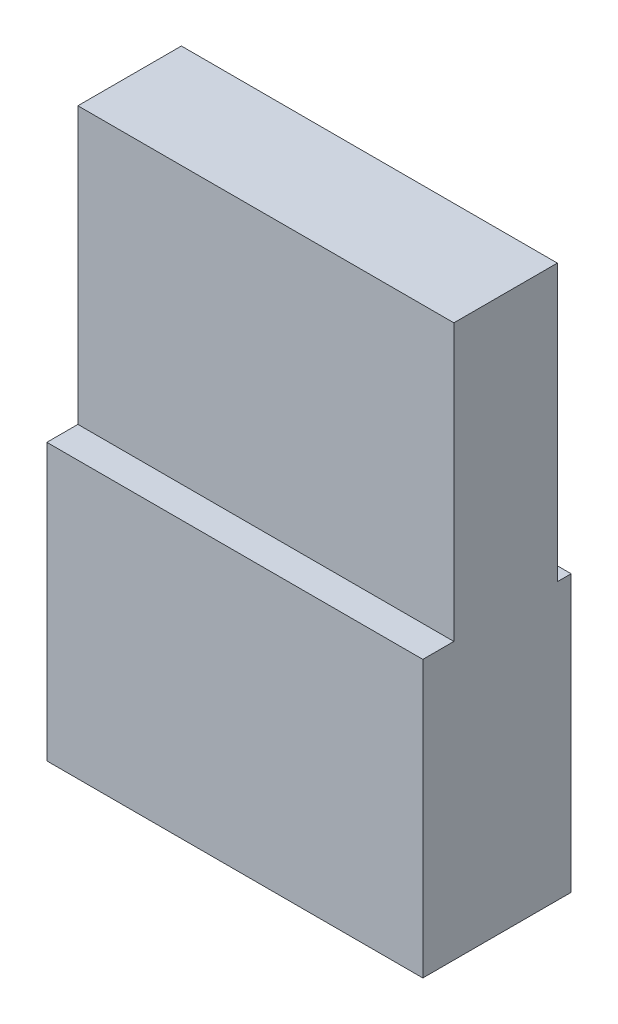
ISO-10303-21;
HEADER;
FILE_DESCRIPTION(('STEP AP214'),'2;1');
FILE_NAME('part.step','',(''),(''),'','','');
FILE_SCHEMA(('AUTOMOTIVE_DESIGN { 1 0 10303 214 1 1 1 1 }'));
ENDSEC;
DATA;
#1=APPLICATION_CONTEXT('core data for automotive mechanical design processes');
#2=APPLICATION_PROTOCOL_DEFINITION('international standard','automotive_design',2000,#1);
#3=PRODUCT_CONTEXT('',#1,'mechanical');
#4=PRODUCT('Part','Part','',(#3));
#5=PRODUCT_RELATED_PRODUCT_CATEGORY('part','',(#4));
#6=PRODUCT_DEFINITION_FORMATION('','',#4);
#7=PRODUCT_DEFINITION_CONTEXT('part definition',#1,'design');
#8=PRODUCT_DEFINITION('design','',#6,#7);
#9=PRODUCT_DEFINITION_SHAPE('','',#8);
#10=(LENGTH_UNIT() NAMED_UNIT(*) SI_UNIT(.MILLI.,.METRE.));
#11=(NAMED_UNIT(*) PLANE_ANGLE_UNIT() SI_UNIT($,.RADIAN.));
#12=(NAMED_UNIT(*) SI_UNIT($,.STERADIAN.) SOLID_ANGLE_UNIT());
#13=UNCERTAINTY_MEASURE_WITH_UNIT(LENGTH_MEASURE(1.E-05),#10,'distance_accuracy_value','');
#14=(GEOMETRIC_REPRESENTATION_CONTEXT(3) GLOBAL_UNCERTAINTY_ASSIGNED_CONTEXT((#13)) GLOBAL_UNIT_ASSIGNED_CONTEXT((#10,
#11,#12)) REPRESENTATION_CONTEXT('',''));
#15=CARTESIAN_POINT('',(0.,0.,0.));
#16=DIRECTION('',(0.,0.,1.));
#17=DIRECTION('',(1.,0.,0.));
#18=AXIS2_PLACEMENT_3D('',#15,#16,#17);
#19=CARTESIAN_POINT('',(0.,4.,0.));
#20=DIRECTION('',(0.,1.,0.));
#21=DIRECTION('',(0.,0.,1.));
#22=AXIS2_PLACEMENT_3D('',#19,#20,#21);
#23=PLANE('',#22);
#24=DIRECTION('',(-1.,0.,0.));
#25=VECTOR('',#24,1.);
#26=CARTESIAN_POINT('',(2.72500000000001,4.,-0.874999999999998));
#27=LINE('',#26,#25);
#28=CARTESIAN_POINT('',(2.72499999999999,4.,-0.874999999999998));
#29=VERTEX_POINT('',#28);
#30=CARTESIAN_POINT('',(-2.72500000000001,4.,-0.874999999999998));
#31=VERTEX_POINT('',#30);
#32=EDGE_CURVE('E118',#29,#31,#27,.T.);
#33=ORIENTED_EDGE('',*,*,#32,.F.);
#34=DIRECTION('',(0.,0.,-1.));
#35=VECTOR('',#34,1.);
#36=CARTESIAN_POINT('',(2.72499999999999,4.,-1.075));
#37=LINE('',#36,#35);
#38=CARTESIAN_POINT('',(2.72499999999999,4.,-1.075));
#39=VERTEX_POINT('',#38);
#40=EDGE_CURVE('E150',#29,#39,#37,.T.);
#41=ORIENTED_EDGE('',*,*,#40,.T.);
#42=DIRECTION('',(-1.,0.,0.));
#43=VECTOR('',#42,1.);
#44=CARTESIAN_POINT('',(-2.72500000000001,4.,-1.075));
#45=LINE('',#44,#43);
#46=CARTESIAN_POINT('',(-2.72500000000001,4.,-1.075));
#47=VERTEX_POINT('',#46);
#48=EDGE_CURVE('E146',#39,#47,#45,.T.);
#49=ORIENTED_EDGE('',*,*,#48,.T.);
#50=DIRECTION('',(0.,0.,1.));
#51=VECTOR('',#50,1.);
#52=CARTESIAN_POINT('',(-2.72500000000001,4.,-1.075));
#53=LINE('',#52,#51);
#54=EDGE_CURVE('E57',#47,#31,#53,.T.);
#55=ORIENTED_EDGE('',*,*,#54,.T.);
#56=EDGE_LOOP('',(#33,#41,#49,#55));
#57=FACE_BOUND('',#56,.T.);
#58=ADVANCED_FACE('F32',(#57),#23,.T.);
#59=CARTESIAN_POINT('',(2.72499999999999,4.,-1.075));
#60=DIRECTION('',(-1.,0.,0.));
#61=DIRECTION('',(0.,0.,1.));
#62=AXIS2_PLACEMENT_3D('',#59,#60,#61);
#63=PLANE('',#62);
#64=DIRECTION('',(0.,0.,-1.));
#65=VECTOR('',#64,1.);
#66=CARTESIAN_POINT('',(2.72499999999999,0.,-1.075));
#67=LINE('',#66,#65);
#68=CARTESIAN_POINT('',(2.72499999999999,0.,1.075));
#69=VERTEX_POINT('',#68);
#70=CARTESIAN_POINT('',(2.72499999999999,0.,-1.075));
#71=VERTEX_POINT('',#70);
#72=EDGE_CURVE('E123',#69,#71,#67,.T.);
#73=ORIENTED_EDGE('',*,*,#72,.T.);
#74=DIRECTION('',(0.,-1.,0.));
#75=VECTOR('',#74,1.);
#76=CARTESIAN_POINT('',(2.72499999999999,4.,-1.075));
#77=LINE('',#76,#75);
#78=EDGE_CURVE('E11',#39,#71,#77,.T.);
#79=ORIENTED_EDGE('',*,*,#78,.F.);
#80=ORIENTED_EDGE('',*,*,#40,.F.);
#81=DIRECTION('',(0.,-1.,0.));
#82=VECTOR('',#81,1.);
#83=CARTESIAN_POINT('',(2.72500000000001,8.,-0.874999999999998));
#84=LINE('',#83,#82);
#85=CARTESIAN_POINT('',(2.72500000000001,8.,-0.874999999999998));
#86=VERTEX_POINT('',#85);
#87=EDGE_CURVE('E128',#86,#29,#84,.T.);
#88=ORIENTED_EDGE('',*,*,#87,.F.);
#89=DIRECTION('',(0.,0.,-1.));
#90=VECTOR('',#89,1.);
#91=CARTESIAN_POINT('',(2.72500000000001,8.,-0.874999999999998));
#92=LINE('',#91,#90);
#93=CARTESIAN_POINT('',(2.72500000000001,8.,0.625000000000002));
#94=VERTEX_POINT('',#93);
#95=EDGE_CURVE('E108',#94,#86,#92,.T.);
#96=ORIENTED_EDGE('',*,*,#95,.F.);
#97=DIRECTION('',(0.,-1.,0.));
#98=VECTOR('',#97,1.);
#99=CARTESIAN_POINT('',(2.72500000000001,8.,0.625000000000002));
#100=LINE('',#99,#98);
#101=CARTESIAN_POINT('',(2.72500000000001,4.,0.625000000000002));
#102=VERTEX_POINT('',#101);
#103=EDGE_CURVE('E105',#94,#102,#100,.T.);
#104=ORIENTED_EDGE('',*,*,#103,.T.);
#105=CARTESIAN_POINT('',(2.72499999999999,4.,1.075));
#106=VERTEX_POINT('',#105);
#107=EDGE_CURVE('E153',#106,#102,#37,.T.);
#108=ORIENTED_EDGE('',*,*,#107,.F.);
#109=DIRECTION('',(0.,-1.,0.));
#110=VECTOR('',#109,1.);
#111=CARTESIAN_POINT('',(2.72499999999999,4.,1.075));
#112=LINE('',#111,#110);
#113=EDGE_CURVE('E160',#106,#69,#112,.T.);
#114=ORIENTED_EDGE('',*,*,#113,.T.);
#115=EDGE_LOOP('',(#73,#79,#80,#88,#96,#104,#108,#114));
#116=FACE_BOUND('',#115,.T.);
#117=ADVANCED_FACE('F34',(#116),#63,.F.);
#118=CARTESIAN_POINT('',(-2.72500000000001,4.,-1.075));
#119=DIRECTION('',(0.,0.,1.));
#120=DIRECTION('',(1.,0.,0.));
#121=AXIS2_PLACEMENT_3D('',#118,#119,#120);
#122=PLANE('',#121);
#123=DIRECTION('',(-1.,0.,0.));
#124=VECTOR('',#123,1.);
#125=CARTESIAN_POINT('',(-2.72500000000001,0.,-1.075));
#126=LINE('',#125,#124);
#127=CARTESIAN_POINT('',(-2.72500000000001,0.,-1.075));
#128=VERTEX_POINT('',#127);
#129=EDGE_CURVE('E126',#71,#128,#126,.T.);
#130=ORIENTED_EDGE('',*,*,#129,.T.);
#131=DIRECTION('',(0.,-1.,0.));
#132=VECTOR('',#131,1.);
#133=CARTESIAN_POINT('',(-2.72500000000001,4.,-1.075));
#134=LINE('',#133,#132);
#135=EDGE_CURVE('E41',#47,#128,#134,.T.);
#136=ORIENTED_EDGE('',*,*,#135,.F.);
#137=ORIENTED_EDGE('',*,*,#48,.F.);
#138=ORIENTED_EDGE('',*,*,#78,.T.);
#139=EDGE_LOOP('',(#130,#136,#137,#138));
#140=FACE_BOUND('',#139,.T.);
#141=ADVANCED_FACE('F178',(#140),#122,.F.);
#142=CARTESIAN_POINT('',(-2.72500000000001,4.,-1.075));
#143=DIRECTION('',(1.,0.,0.));
#144=DIRECTION('',(0.,0.,-1.));
#145=AXIS2_PLACEMENT_3D('',#142,#143,#144);
#146=PLANE('',#145);
#147=DIRECTION('',(0.,0.,1.));
#148=VECTOR('',#147,1.);
#149=CARTESIAN_POINT('',(-2.72500000000001,0.,-1.075));
#150=LINE('',#149,#148);
#151=CARTESIAN_POINT('',(-2.72500000000001,0.,1.075));
#152=VERTEX_POINT('',#151);
#153=EDGE_CURVE('E166',#128,#152,#150,.T.);
#154=ORIENTED_EDGE('',*,*,#153,.T.);
#155=DIRECTION('',(0.,-1.,0.));
#156=VECTOR('',#155,1.);
#157=CARTESIAN_POINT('',(-2.72500000000001,4.,1.075));
#158=LINE('',#157,#156);
#159=CARTESIAN_POINT('',(-2.72500000000001,4.,1.075));
#160=VERTEX_POINT('',#159);
#161=EDGE_CURVE('E157',#160,#152,#158,.T.);
#162=ORIENTED_EDGE('',*,*,#161,.F.);
#163=CARTESIAN_POINT('',(-2.72500000000001,4.,0.625000000000003));
#164=VERTEX_POINT('',#163);
#165=EDGE_CURVE('E122',#164,#160,#53,.T.);
#166=ORIENTED_EDGE('',*,*,#165,.F.);
#167=DIRECTION('',(0.,-1.,0.));
#168=VECTOR('',#167,1.);
#169=CARTESIAN_POINT('',(-2.72500000000001,8.,0.625000000000003));
#170=LINE('',#169,#168);
#171=CARTESIAN_POINT('',(-2.72500000000001,8.,0.625000000000003));
#172=VERTEX_POINT('',#171);
#173=EDGE_CURVE('E103',#172,#164,#170,.T.);
#174=ORIENTED_EDGE('',*,*,#173,.F.);
#175=DIRECTION('',(0.,0.,1.));
#176=VECTOR('',#175,1.);
#177=CARTESIAN_POINT('',(-2.72500000000001,8.,-0.874999999999997));
#178=LINE('',#177,#176);
#179=CARTESIAN_POINT('',(-2.72500000000001,8.,-0.874999999999997));
#180=VERTEX_POINT('',#179);
#181=EDGE_CURVE('E109',#180,#172,#178,.T.);
#182=ORIENTED_EDGE('',*,*,#181,.F.);
#183=DIRECTION('',(0.,-1.,0.));
#184=VECTOR('',#183,1.);
#185=CARTESIAN_POINT('',(-2.72500000000001,8.,-0.874999999999997));
#186=LINE('',#185,#184);
#187=EDGE_CURVE('E137',#180,#31,#186,.T.);
#188=ORIENTED_EDGE('',*,*,#187,.T.);
#189=ORIENTED_EDGE('',*,*,#54,.F.);
#190=ORIENTED_EDGE('',*,*,#135,.T.);
#191=EDGE_LOOP('',(#154,#162,#166,#174,#182,#188,#189,#190));
#192=FACE_BOUND('',#191,.T.);
#193=ADVANCED_FACE('F120',(#192),#146,.F.);
#194=CARTESIAN_POINT('',(-2.72500000000001,4.,1.075));
#195=DIRECTION('',(0.,0.,-1.));
#196=DIRECTION('',(-1.,0.,0.));
#197=AXIS2_PLACEMENT_3D('',#194,#195,#196);
#198=PLANE('',#197);
#199=DIRECTION('',(1.,0.,0.));
#200=VECTOR('',#199,1.);
#201=CARTESIAN_POINT('',(-2.72500000000001,0.,1.075));
#202=LINE('',#201,#200);
#203=EDGE_CURVE('E164',#152,#69,#202,.T.);
#204=ORIENTED_EDGE('',*,*,#203,.T.);
#205=ORIENTED_EDGE('',*,*,#113,.F.);
#206=DIRECTION('',(1.,0.,0.));
#207=VECTOR('',#206,1.);
#208=CARTESIAN_POINT('',(-2.72500000000001,4.,1.075));
#209=LINE('',#208,#207);
#210=EDGE_CURVE('E163',#160,#106,#209,.T.);
#211=ORIENTED_EDGE('',*,*,#210,.F.);
#212=ORIENTED_EDGE('',*,*,#161,.T.);
#213=EDGE_LOOP('',(#204,#205,#211,#212));
#214=FACE_BOUND('',#213,.T.);
#215=ADVANCED_FACE('F203',(#214),#198,.F.);
#216=DIRECTION('',(1.,0.,0.));
#217=VECTOR('',#216,1.);
#218=CARTESIAN_POINT('',(2.72500000000001,4.,0.625000000000002));
#219=LINE('',#218,#217);
#220=EDGE_CURVE('E49',#164,#102,#219,.T.);
#221=ORIENTED_EDGE('',*,*,#220,.F.);
#222=ORIENTED_EDGE('',*,*,#165,.T.);
#223=ORIENTED_EDGE('',*,*,#210,.T.);
#224=ORIENTED_EDGE('',*,*,#107,.T.);
#225=EDGE_LOOP('',(#221,#222,#223,#224));
#226=FACE_BOUND('',#225,.T.);
#227=ADVANCED_FACE('F197',(#226),#23,.T.);
#228=CARTESIAN_POINT('',(0.,0.,0.));
#229=DIRECTION('',(0.,1.,0.));
#230=DIRECTION('',(0.,0.,1.));
#231=AXIS2_PLACEMENT_3D('',#228,#229,#230);
#232=PLANE('',#231);
#233=ORIENTED_EDGE('',*,*,#72,.F.);
#234=ORIENTED_EDGE('',*,*,#203,.F.);
#235=ORIENTED_EDGE('',*,*,#153,.F.);
#236=ORIENTED_EDGE('',*,*,#129,.F.);
#237=EDGE_LOOP('',(#233,#234,#235,#236));
#238=FACE_BOUND('',#237,.T.);
#239=ADVANCED_FACE('F193',(#238),#232,.F.);
#240=CARTESIAN_POINT('',(2.72500000000001,8.,0.625000000000002));
#241=DIRECTION('',(0.,0.,-1.));
#242=DIRECTION('',(-1.,0.,0.));
#243=AXIS2_PLACEMENT_3D('',#240,#241,#242);
#244=PLANE('',#243);
#245=ORIENTED_EDGE('',*,*,#220,.T.);
#246=ORIENTED_EDGE('',*,*,#103,.F.);
#247=DIRECTION('',(1.,0.,0.));
#248=VECTOR('',#247,1.);
#249=CARTESIAN_POINT('',(2.72500000000001,8.,0.625000000000002));
#250=LINE('',#249,#248);
#251=EDGE_CURVE('E99',#172,#94,#250,.T.);
#252=ORIENTED_EDGE('',*,*,#251,.F.);
#253=ORIENTED_EDGE('',*,*,#173,.T.);
#254=EDGE_LOOP('',(#245,#246,#252,#253));
#255=FACE_BOUND('',#254,.T.);
#256=ADVANCED_FACE('F101',(#255),#244,.F.);
#257=CARTESIAN_POINT('',(2.72500000000001,8.,-0.874999999999998));
#258=DIRECTION('',(0.,0.,1.));
#259=DIRECTION('',(1.,0.,0.));
#260=AXIS2_PLACEMENT_3D('',#257,#258,#259);
#261=PLANE('',#260);
#262=ORIENTED_EDGE('',*,*,#32,.T.);
#263=ORIENTED_EDGE('',*,*,#187,.F.);
#264=DIRECTION('',(-1.,0.,0.));
#265=VECTOR('',#264,1.);
#266=CARTESIAN_POINT('',(2.72500000000001,8.,-0.874999999999998));
#267=LINE('',#266,#265);
#268=EDGE_CURVE('E114',#86,#180,#267,.T.);
#269=ORIENTED_EDGE('',*,*,#268,.F.);
#270=ORIENTED_EDGE('',*,*,#87,.T.);
#271=EDGE_LOOP('',(#262,#263,#269,#270));
#272=FACE_BOUND('',#271,.T.);
#273=ADVANCED_FACE('F185',(#272),#261,.F.);
#274=CARTESIAN_POINT('',(0.,8.,0.));
#275=DIRECTION('',(0.,-1.,0.));
#276=DIRECTION('',(0.,0.,-1.));
#277=AXIS2_PLACEMENT_3D('',#274,#275,#276);
#278=PLANE('',#277);
#279=ORIENTED_EDGE('',*,*,#181,.T.);
#280=ORIENTED_EDGE('',*,*,#251,.T.);
#281=ORIENTED_EDGE('',*,*,#95,.T.);
#282=ORIENTED_EDGE('',*,*,#268,.T.);
#283=EDGE_LOOP('',(#279,#280,#281,#282));
#284=FACE_BOUND('',#283,.T.);
#285=ADVANCED_FACE('F112',(#284),#278,.F.);
#286=CLOSED_SHELL('',(#58,#117,#141,#193,#215,#227,#239,#256,#273,#285));
#287=MANIFOLD_SOLID_BREP('B2',#286);
#288=ADVANCED_BREP_SHAPE_REPRESENTATION('',(#18,#287),#14);
#289=SHAPE_DEFINITION_REPRESENTATION(#9,#288);
ENDSEC;
END-ISO-10303-21;
